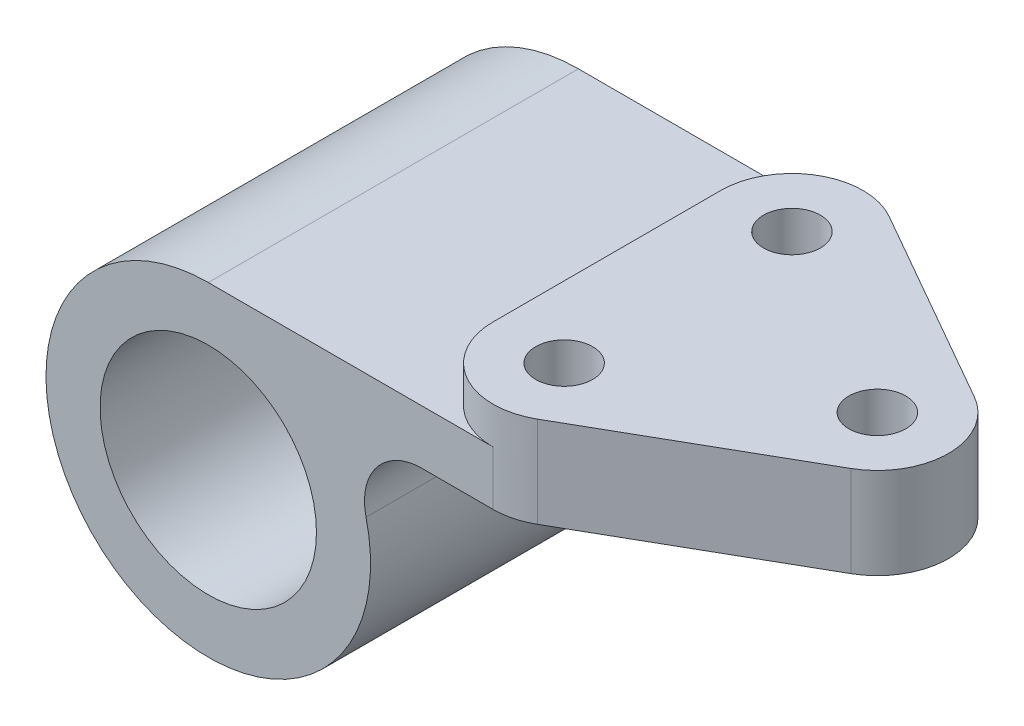
ISO-10303-21;
HEADER;
FILE_DESCRIPTION(('STEP AP214'),'2;1');
FILE_NAME('part.step','',(''),(''),'','','');
FILE_SCHEMA(('AUTOMOTIVE_DESIGN { 1 0 10303 214 1 1 1 1 }'));
ENDSEC;
DATA;
#1=APPLICATION_CONTEXT('core data for automotive mechanical design processes');
#2=APPLICATION_PROTOCOL_DEFINITION('international standard','automotive_design',2000,#1);
#3=PRODUCT_CONTEXT('',#1,'mechanical');
#4=PRODUCT('Part','Part','',(#3));
#5=PRODUCT_RELATED_PRODUCT_CATEGORY('part','',(#4));
#6=PRODUCT_DEFINITION_FORMATION('','',#4);
#7=PRODUCT_DEFINITION_CONTEXT('part definition',#1,'design');
#8=PRODUCT_DEFINITION('design','',#6,#7);
#9=PRODUCT_DEFINITION_SHAPE('','',#8);
#10=(LENGTH_UNIT() NAMED_UNIT(*) SI_UNIT(.MILLI.,.METRE.));
#11=(NAMED_UNIT(*) PLANE_ANGLE_UNIT() SI_UNIT($,.RADIAN.));
#12=(NAMED_UNIT(*) SI_UNIT($,.STERADIAN.) SOLID_ANGLE_UNIT());
#13=UNCERTAINTY_MEASURE_WITH_UNIT(LENGTH_MEASURE(1.E-05),#10,'distance_accuracy_value','');
#14=(GEOMETRIC_REPRESENTATION_CONTEXT(3) GLOBAL_UNCERTAINTY_ASSIGNED_CONTEXT((#13)) GLOBAL_UNIT_ASSIGNED_CONTEXT((#10,
#11,#12)) REPRESENTATION_CONTEXT('',''));
#15=CARTESIAN_POINT('',(0.,0.,0.));
#16=DIRECTION('',(0.,0.,1.));
#17=DIRECTION('',(1.,0.,0.));
#18=AXIS2_PLACEMENT_3D('',#15,#16,#17);
#19=CARTESIAN_POINT('',(37.4332739684896,19.,32.5));
#20=DIRECTION('',(0.,1.,0.));
#21=DIRECTION('',(0.,0.,1.));
#22=AXIS2_PLACEMENT_3D('',#19,#20,#21);
#23=PLANE('',#22);
#24=CARTESIAN_POINT('',(50.,19.,-20.));
#25=DIRECTION('',(0.,1.,0.));
#26=DIRECTION('',(0.,0.,1.));
#27=AXIS2_PLACEMENT_3D('',#24,#25,#26);
#28=CIRCLE('',#27,5.);
#29=CARTESIAN_POINT('',(50.,19.,-15.));
#30=VERTEX_POINT('',#29);
#31=EDGE_CURVE('E250',#30,#30,#28,.T.);
#32=ORIENTED_EDGE('',*,*,#31,.T.);
#33=EDGE_LOOP('',(#32));
#34=FACE_BOUND('',#33,.T.);
#35=DIRECTION('',(1.,0.,0.));
#36=VECTOR('',#35,1.);
#37=CARTESIAN_POINT('',(37.4332739684896,19.,-32.5));
#38=LINE('',#37,#36);
#39=CARTESIAN_POINT('',(37.4332739684896,19.,-32.5));
#40=VERTEX_POINT('',#39);
#41=CARTESIAN_POINT('',(50.,19.,-32.5));
#42=VERTEX_POINT('',#41);
#43=EDGE_CURVE('E178',#40,#42,#38,.T.);
#44=ORIENTED_EDGE('',*,*,#43,.T.);
#45=CARTESIAN_POINT('',(50.,19.,-20.));
#46=DIRECTION('',(0.,1.,0.));
#47=DIRECTION('',(0.,0.,1.));
#48=AXIS2_PLACEMENT_3D('',#45,#46,#47);
#49=CIRCLE('',#48,12.5);
#50=CARTESIAN_POINT('',(56.2017367294604,19.,-30.8530392765557));
#51=VERTEX_POINT('',#50);
#52=EDGE_CURVE('E211',#51,#42,#49,.T.);
#53=ORIENTED_EDGE('',*,*,#52,.F.);
#54=DIRECTION('',(-0.86824314212446,0.,-0.496138938356834));
#55=VECTOR('',#54,1.);
#56=CARTESIAN_POINT('',(69.3437432595526,19.,-23.3433212593602));
#57=LINE('',#56,#55);
#58=CARTESIAN_POINT('',(91.2017367294604,19.,-10.8530392765557));
#59=VERTEX_POINT('',#58);
#60=EDGE_CURVE('E213',#59,#51,#57,.T.);
#61=ORIENTED_EDGE('',*,*,#60,.F.);
#62=CARTESIAN_POINT('',(85.,19.,0.));
#63=DIRECTION('',(0.,1.,0.));
#64=DIRECTION('',(0.,0.,1.));
#65=AXIS2_PLACEMENT_3D('',#62,#63,#64);
#66=CIRCLE('',#65,12.5);
#67=CARTESIAN_POINT('',(91.2017367294604,19.,10.8530392765557));
#68=VERTEX_POINT('',#67);
#69=EDGE_CURVE('E240',#68,#59,#66,.T.);
#70=ORIENTED_EDGE('',*,*,#69,.F.);
#71=DIRECTION('',(0.86824314212446,0.,-0.496138938356834));
#72=VECTOR('',#71,1.);
#73=CARTESIAN_POINT('',(41.3437432595526,19.,39.3433212593602));
#74=LINE('',#73,#72);
#75=CARTESIAN_POINT('',(56.2017367294604,19.,30.8530392765557));
#76=VERTEX_POINT('',#75);
#77=EDGE_CURVE('E153',#76,#68,#74,.T.);
#78=ORIENTED_EDGE('',*,*,#77,.F.);
#79=CARTESIAN_POINT('',(50.,19.,20.));
#80=DIRECTION('',(0.,1.,0.));
#81=DIRECTION('',(0.,0.,1.));
#82=AXIS2_PLACEMENT_3D('',#79,#80,#81);
#83=CIRCLE('',#82,12.5);
#84=CARTESIAN_POINT('',(50.,19.,32.5));
#85=VERTEX_POINT('',#84);
#86=EDGE_CURVE('E149',#85,#76,#83,.T.);
#87=ORIENTED_EDGE('',*,*,#86,.F.);
#88=DIRECTION('',(1.,0.,0.));
#89=VECTOR('',#88,1.);
#90=CARTESIAN_POINT('',(37.4332739684896,19.,32.5));
#91=LINE('',#90,#89);
#92=CARTESIAN_POINT('',(37.4332739684896,19.,32.5));
#93=VERTEX_POINT('',#92);
#94=EDGE_CURVE('E78',#93,#85,#91,.T.);
#95=ORIENTED_EDGE('',*,*,#94,.F.);
#96=DIRECTION('',(0.,0.,-1.));
#97=VECTOR('',#96,1.);
#98=CARTESIAN_POINT('',(37.4332739684896,19.,32.5));
#99=LINE('',#98,#97);
#100=EDGE_CURVE('E188',#93,#40,#99,.T.);
#101=ORIENTED_EDGE('',*,*,#100,.T.);
#102=EDGE_LOOP('',(#44,#53,#61,#70,#78,#87,#95,#101));
#103=FACE_BOUND('',#102,.T.);
#104=CARTESIAN_POINT('',(85.,19.,0.));
#105=DIRECTION('',(0.,1.,0.));
#106=DIRECTION('',(0.,0.,1.));
#107=AXIS2_PLACEMENT_3D('',#104,#105,#106);
#108=CIRCLE('',#107,5.);
#109=CARTESIAN_POINT('',(85.,19.,5.));
#110=VERTEX_POINT('',#109);
#111=EDGE_CURVE('E256',#110,#110,#108,.T.);
#112=ORIENTED_EDGE('',*,*,#111,.T.);
#113=EDGE_LOOP('',(#112));
#114=FACE_BOUND('',#113,.T.);
#115=CARTESIAN_POINT('',(50.,19.,20.));
#116=DIRECTION('',(0.,1.,0.));
#117=DIRECTION('',(0.,0.,1.));
#118=AXIS2_PLACEMENT_3D('',#115,#116,#117);
#119=CIRCLE('',#118,5.);
#120=CARTESIAN_POINT('',(50.,19.,25.));
#121=VERTEX_POINT('',#120);
#122=EDGE_CURVE('E244',#121,#121,#119,.T.);
#123=ORIENTED_EDGE('',*,*,#122,.T.);
#124=EDGE_LOOP('',(#123));
#125=FACE_BOUND('',#124,.T.);
#126=ADVANCED_FACE('F34',(#34,#103,#114,#125),#23,.F.);
#127=CARTESIAN_POINT('',(37.4332739684896,9.,32.5));
#128=DIRECTION('',(0.,0.,1.));
#129=DIRECTION('',(1.,0.,0.));
#130=AXIS2_PLACEMENT_3D('',#127,#128,#129);
#131=PLANE('',#130);
#132=CARTESIAN_POINT('',(37.4332739684896,9.,32.5));
#133=DIRECTION('',(0.,0.,-1.));
#134=DIRECTION('',(1.,0.,0.));
#135=AXIS2_PLACEMENT_3D('',#132,#133,#134);
#136=CIRCLE('',#135,10.);
#137=CARTESIAN_POINT('',(27.7103456649858,6.66233766233765,32.5));
#138=VERTEX_POINT('',#137);
#139=EDGE_CURVE('E166',#138,#93,#136,.T.);
#140=ORIENTED_EDGE('',*,*,#139,.T.);
#141=ORIENTED_EDGE('',*,*,#94,.T.);
#142=DIRECTION('',(0.,1.,0.));
#143=VECTOR('',#142,1.);
#144=CARTESIAN_POINT('',(50.,19.,32.5));
#145=LINE('',#144,#143);
#146=CARTESIAN_POINT('',(50.,28.5,32.5));
#147=VERTEX_POINT('',#146);
#148=EDGE_CURVE('E169',#85,#147,#145,.T.);
#149=ORIENTED_EDGE('',*,*,#148,.T.);
#150=DIRECTION('',(-1.,0.,0.));
#151=VECTOR('',#150,1.);
#152=CARTESIAN_POINT('',(0.,28.5,32.5));
#153=LINE('',#152,#151);
#154=CARTESIAN_POINT('',(0.,28.5,32.5));
#155=VERTEX_POINT('',#154);
#156=EDGE_CURVE('E172',#147,#155,#153,.T.);
#157=ORIENTED_EDGE('',*,*,#156,.T.);
#158=CARTESIAN_POINT('',(0.,0.,32.5));
#159=DIRECTION('',(0.,0.,1.));
#160=DIRECTION('',(1.,0.,0.));
#161=AXIS2_PLACEMENT_3D('',#158,#159,#160);
#162=CIRCLE('',#161,28.5);
#163=EDGE_CURVE('E51',#155,#138,#162,.T.);
#164=ORIENTED_EDGE('',*,*,#163,.T.);
#165=EDGE_LOOP('',(#140,#141,#149,#157,#164));
#166=FACE_BOUND('',#165,.T.);
#167=CARTESIAN_POINT('',(0.,0.,32.5));
#168=DIRECTION('',(0.,0.,1.));
#169=DIRECTION('',(1.,0.,0.));
#170=AXIS2_PLACEMENT_3D('',#167,#168,#169);
#171=CIRCLE('',#170,19.);
#172=CARTESIAN_POINT('',(19.,0.,32.5));
#173=VERTEX_POINT('',#172);
#174=EDGE_CURVE('E157',#173,#173,#171,.T.);
#175=ORIENTED_EDGE('',*,*,#174,.F.);
#176=EDGE_LOOP('',(#175));
#177=FACE_BOUND('',#176,.T.);
#178=ADVANCED_FACE('F208',(#166,#177),#131,.T.);
#179=CARTESIAN_POINT('',(37.4332739684896,9.,-32.5));
#180=DIRECTION('',(0.,0.,1.));
#181=DIRECTION('',(1.,0.,0.));
#182=AXIS2_PLACEMENT_3D('',#179,#180,#181);
#183=PLANE('',#182);
#184=CARTESIAN_POINT('',(37.4332739684896,9.,-32.5));
#185=DIRECTION('',(0.,0.,-1.));
#186=DIRECTION('',(1.,0.,0.));
#187=AXIS2_PLACEMENT_3D('',#184,#185,#186);
#188=CIRCLE('',#187,10.);
#189=CARTESIAN_POINT('',(27.7103456649858,6.66233766233765,-32.5));
#190=VERTEX_POINT('',#189);
#191=EDGE_CURVE('E164',#190,#40,#188,.T.);
#192=ORIENTED_EDGE('',*,*,#191,.F.);
#193=CARTESIAN_POINT('',(0.,0.,-32.5));
#194=DIRECTION('',(0.,0.,1.));
#195=DIRECTION('',(1.,0.,0.));
#196=AXIS2_PLACEMENT_3D('',#193,#194,#195);
#197=CIRCLE('',#196,28.5);
#198=CARTESIAN_POINT('',(0.,28.5,-32.5));
#199=VERTEX_POINT('',#198);
#200=EDGE_CURVE('E71',#199,#190,#197,.T.);
#201=ORIENTED_EDGE('',*,*,#200,.F.);
#202=DIRECTION('',(-1.,0.,0.));
#203=VECTOR('',#202,1.);
#204=CARTESIAN_POINT('',(0.,28.5,-32.5));
#205=LINE('',#204,#203);
#206=CARTESIAN_POINT('',(50.,28.5,-32.5));
#207=VERTEX_POINT('',#206);
#208=EDGE_CURVE('E66',#207,#199,#205,.T.);
#209=ORIENTED_EDGE('',*,*,#208,.F.);
#210=DIRECTION('',(0.,1.,0.));
#211=VECTOR('',#210,1.);
#212=CARTESIAN_POINT('',(50.,19.,-32.5));
#213=LINE('',#212,#211);
#214=EDGE_CURVE('E181',#42,#207,#213,.T.);
#215=ORIENTED_EDGE('',*,*,#214,.F.);
#216=ORIENTED_EDGE('',*,*,#43,.F.);
#217=EDGE_LOOP('',(#192,#201,#209,#215,#216));
#218=FACE_BOUND('',#217,.T.);
#219=CARTESIAN_POINT('',(0.,0.,-32.5));
#220=DIRECTION('',(0.,0.,1.));
#221=DIRECTION('',(1.,0.,0.));
#222=AXIS2_PLACEMENT_3D('',#219,#220,#221);
#223=CIRCLE('',#222,19.);
#224=CARTESIAN_POINT('',(19.,0.,-32.5));
#225=VERTEX_POINT('',#224);
#226=EDGE_CURVE('E154',#225,#225,#223,.T.);
#227=ORIENTED_EDGE('',*,*,#226,.T.);
#228=EDGE_LOOP('',(#227));
#229=FACE_BOUND('',#228,.T.);
#230=ADVANCED_FACE('F231',(#218,#229),#183,.F.);
#231=CARTESIAN_POINT('',(37.4332739684896,9.,32.5));
#232=DIRECTION('',(0.,0.,-1.));
#233=DIRECTION('',(-1.,0.,0.));
#234=AXIS2_PLACEMENT_3D('',#231,#232,#233);
#235=CYLINDRICAL_SURFACE('',#234,10.);
#236=ORIENTED_EDGE('',*,*,#191,.T.);
#237=ORIENTED_EDGE('',*,*,#100,.F.);
#238=ORIENTED_EDGE('',*,*,#139,.F.);
#239=DIRECTION('',(0.,0.,-1.));
#240=VECTOR('',#239,1.);
#241=CARTESIAN_POINT('',(27.7103456649858,6.66233766233765,32.5));
#242=LINE('',#241,#240);
#243=EDGE_CURVE('E175',#138,#190,#242,.T.);
#244=ORIENTED_EDGE('',*,*,#243,.T.);
#245=EDGE_LOOP('',(#236,#237,#238,#244));
#246=FACE_BOUND('',#245,.T.);
#247=ADVANCED_FACE('F36',(#246),#235,.F.);
#248=CARTESIAN_POINT('',(0.,28.5,32.5));
#249=DIRECTION('',(0.,-1.,0.));
#250=DIRECTION('',(0.,0.,-1.));
#251=AXIS2_PLACEMENT_3D('',#248,#249,#250);
#252=PLANE('',#251);
#253=CARTESIAN_POINT('',(50.,28.5,-20.));
#254=DIRECTION('',(0.,-1.,0.));
#255=DIRECTION('',(0.,0.,-1.));
#256=AXIS2_PLACEMENT_3D('',#253,#254,#255);
#257=CIRCLE('',#256,12.5);
#258=CARTESIAN_POINT('',(37.5,28.5,-20.));
#259=VERTEX_POINT('',#258);
#260=EDGE_CURVE('E11',#207,#259,#257,.F.);
#261=ORIENTED_EDGE('',*,*,#260,.F.);
#262=ORIENTED_EDGE('',*,*,#208,.T.);
#263=DIRECTION('',(0.,0.,-1.));
#264=VECTOR('',#263,1.);
#265=CARTESIAN_POINT('',(0.,28.5,32.5));
#266=LINE('',#265,#264);
#267=EDGE_CURVE('E186',#155,#199,#266,.T.);
#268=ORIENTED_EDGE('',*,*,#267,.F.);
#269=ORIENTED_EDGE('',*,*,#156,.F.);
#270=CARTESIAN_POINT('',(50.,28.5,20.));
#271=DIRECTION('',(0.,-1.,0.));
#272=DIRECTION('',(0.,0.,-1.));
#273=AXIS2_PLACEMENT_3D('',#270,#271,#272);
#274=CIRCLE('',#273,12.5);
#275=CARTESIAN_POINT('',(37.5,28.5,20.));
#276=VERTEX_POINT('',#275);
#277=EDGE_CURVE('E190',#276,#147,#274,.F.);
#278=ORIENTED_EDGE('',*,*,#277,.F.);
#279=DIRECTION('',(0.,0.,1.));
#280=VECTOR('',#279,1.);
#281=CARTESIAN_POINT('',(37.5,28.5,32.5));
#282=LINE('',#281,#280);
#283=EDGE_CURVE('E43',#259,#276,#282,.T.);
#284=ORIENTED_EDGE('',*,*,#283,.F.);
#285=EDGE_LOOP('',(#261,#262,#268,#269,#278,#284));
#286=FACE_BOUND('',#285,.T.);
#287=ADVANCED_FACE('F207',(#286),#252,.F.);
#288=CARTESIAN_POINT('',(0.,0.,32.5));
#289=DIRECTION('',(0.,0.,-1.));
#290=DIRECTION('',(-1.,0.,0.));
#291=AXIS2_PLACEMENT_3D('',#288,#289,#290);
#292=CYLINDRICAL_SURFACE('',#291,28.5);
#293=ORIENTED_EDGE('',*,*,#200,.T.);
#294=ORIENTED_EDGE('',*,*,#243,.F.);
#295=ORIENTED_EDGE('',*,*,#163,.F.);
#296=ORIENTED_EDGE('',*,*,#267,.T.);
#297=EDGE_LOOP('',(#293,#294,#295,#296));
#298=FACE_BOUND('',#297,.T.);
#299=ADVANCED_FACE('F289',(#298),#292,.T.);
#300=CARTESIAN_POINT('',(0.,0.,32.5));
#301=DIRECTION('',(0.,0.,-1.));
#302=DIRECTION('',(-1.,0.,0.));
#303=AXIS2_PLACEMENT_3D('',#300,#301,#302);
#304=CYLINDRICAL_SURFACE('',#303,19.);
#305=ORIENTED_EDGE('',*,*,#174,.T.);
#306=EDGE_LOOP('',(#305));
#307=FACE_BOUND('',#306,.T.);
#308=ORIENTED_EDGE('',*,*,#226,.F.);
#309=EDGE_LOOP('',(#308));
#310=FACE_BOUND('',#309,.T.);
#311=ADVANCED_FACE('F292',(#307,#310),#304,.F.);
#312=CARTESIAN_POINT('',(50.,35.,-20.));
#313=DIRECTION('',(0.,-1.,0.));
#314=DIRECTION('',(0.,0.,-1.));
#315=AXIS2_PLACEMENT_3D('',#312,#313,#314);
#316=CYLINDRICAL_SURFACE('',#315,12.5);
#317=ORIENTED_EDGE('',*,*,#52,.T.);
#318=ORIENTED_EDGE('',*,*,#214,.T.);
#319=ORIENTED_EDGE('',*,*,#260,.T.);
#320=DIRECTION('',(0.,-1.,0.));
#321=VECTOR('',#320,1.);
#322=CARTESIAN_POINT('',(37.5,35.,-20.));
#323=LINE('',#322,#321);
#324=CARTESIAN_POINT('',(37.5,35.,-20.));
#325=VERTEX_POINT('',#324);
#326=EDGE_CURVE('E200',#325,#259,#323,.T.);
#327=ORIENTED_EDGE('',*,*,#326,.F.);
#328=CARTESIAN_POINT('',(50.,35.,-20.));
#329=DIRECTION('',(0.,1.,0.));
#330=DIRECTION('',(0.,0.,1.));
#331=AXIS2_PLACEMENT_3D('',#328,#329,#330);
#332=CIRCLE('',#331,12.5);
#333=CARTESIAN_POINT('',(56.2017367294604,35.,-30.8530392765557));
#334=VERTEX_POINT('',#333);
#335=EDGE_CURVE('E224',#334,#325,#332,.T.);
#336=ORIENTED_EDGE('',*,*,#335,.F.);
#337=DIRECTION('',(0.,-1.,0.));
#338=VECTOR('',#337,1.);
#339=CARTESIAN_POINT('',(56.2017367294604,35.,-30.8530392765557));
#340=LINE('',#339,#338);
#341=EDGE_CURVE('E159',#334,#51,#340,.T.);
#342=ORIENTED_EDGE('',*,*,#341,.T.);
#343=EDGE_LOOP('',(#317,#318,#319,#327,#336,#342));
#344=FACE_BOUND('',#343,.T.);
#345=ADVANCED_FACE('F223',(#344),#316,.T.);
#346=CARTESIAN_POINT('',(37.5,35.,32.5));
#347=DIRECTION('',(1.,0.,0.));
#348=DIRECTION('',(0.,0.,-1.));
#349=AXIS2_PLACEMENT_3D('',#346,#347,#348);
#350=PLANE('',#349);
#351=ORIENTED_EDGE('',*,*,#326,.T.);
#352=ORIENTED_EDGE('',*,*,#283,.T.);
#353=DIRECTION('',(0.,-1.,0.));
#354=VECTOR('',#353,1.);
#355=CARTESIAN_POINT('',(37.5,35.,20.));
#356=LINE('',#355,#354);
#357=CARTESIAN_POINT('',(37.5,35.,20.));
#358=VERTEX_POINT('',#357);
#359=EDGE_CURVE('E198',#358,#276,#356,.T.);
#360=ORIENTED_EDGE('',*,*,#359,.F.);
#361=DIRECTION('',(0.,0.,1.));
#362=VECTOR('',#361,1.);
#363=CARTESIAN_POINT('',(37.5,35.,32.5));
#364=LINE('',#363,#362);
#365=EDGE_CURVE('E233',#325,#358,#364,.T.);
#366=ORIENTED_EDGE('',*,*,#365,.F.);
#367=EDGE_LOOP('',(#351,#352,#360,#366));
#368=FACE_BOUND('',#367,.T.);
#369=ADVANCED_FACE('F196',(#368),#350,.F.);
#370=CARTESIAN_POINT('',(50.,35.,20.));
#371=DIRECTION('',(0.,-1.,0.));
#372=DIRECTION('',(0.,0.,-1.));
#373=AXIS2_PLACEMENT_3D('',#370,#371,#372);
#374=CYLINDRICAL_SURFACE('',#373,12.5);
#375=ORIENTED_EDGE('',*,*,#277,.T.);
#376=ORIENTED_EDGE('',*,*,#148,.F.);
#377=ORIENTED_EDGE('',*,*,#86,.T.);
#378=DIRECTION('',(0.,-1.,0.));
#379=VECTOR('',#378,1.);
#380=CARTESIAN_POINT('',(56.2017367294604,35.,30.8530392765557));
#381=LINE('',#380,#379);
#382=CARTESIAN_POINT('',(56.2017367294604,35.,30.8530392765557));
#383=VERTEX_POINT('',#382);
#384=EDGE_CURVE('E204',#383,#76,#381,.T.);
#385=ORIENTED_EDGE('',*,*,#384,.F.);
#386=CARTESIAN_POINT('',(50.,35.,20.));
#387=DIRECTION('',(0.,1.,0.));
#388=DIRECTION('',(0.,0.,1.));
#389=AXIS2_PLACEMENT_3D('',#386,#387,#388);
#390=CIRCLE('',#389,12.5);
#391=EDGE_CURVE('E145',#358,#383,#390,.T.);
#392=ORIENTED_EDGE('',*,*,#391,.F.);
#393=ORIENTED_EDGE('',*,*,#359,.T.);
#394=EDGE_LOOP('',(#375,#376,#377,#385,#392,#393));
#395=FACE_BOUND('',#394,.T.);
#396=ADVANCED_FACE('F203',(#395),#374,.T.);
#397=CARTESIAN_POINT('',(50.,35.,20.));
#398=DIRECTION('',(0.,-1.,0.));
#399=DIRECTION('',(0.,0.,-1.));
#400=AXIS2_PLACEMENT_3D('',#397,#398,#399);
#401=CYLINDRICAL_SURFACE('',#400,5.);
#402=ORIENTED_EDGE('',*,*,#122,.F.);
#403=EDGE_LOOP('',(#402));
#404=FACE_BOUND('',#403,.T.);
#405=CARTESIAN_POINT('',(50.,35.,20.));
#406=DIRECTION('',(0.,1.,0.));
#407=DIRECTION('',(0.,0.,1.));
#408=AXIS2_PLACEMENT_3D('',#405,#406,#407);
#409=CIRCLE('',#408,5.);
#410=CARTESIAN_POINT('',(50.,35.,25.));
#411=VERTEX_POINT('',#410);
#412=EDGE_CURVE('E241',#411,#411,#409,.T.);
#413=ORIENTED_EDGE('',*,*,#412,.T.);
#414=EDGE_LOOP('',(#413));
#415=FACE_BOUND('',#414,.T.);
#416=ADVANCED_FACE('F274',(#404,#415),#401,.F.);
#417=CARTESIAN_POINT('',(50.,35.,-20.));
#418=DIRECTION('',(0.,-1.,0.));
#419=DIRECTION('',(0.,0.,-1.));
#420=AXIS2_PLACEMENT_3D('',#417,#418,#419);
#421=CYLINDRICAL_SURFACE('',#420,5.);
#422=ORIENTED_EDGE('',*,*,#31,.F.);
#423=EDGE_LOOP('',(#422));
#424=FACE_BOUND('',#423,.T.);
#425=CARTESIAN_POINT('',(50.,35.,-20.));
#426=DIRECTION('',(0.,1.,0.));
#427=DIRECTION('',(0.,0.,1.));
#428=AXIS2_PLACEMENT_3D('',#425,#426,#427);
#429=CIRCLE('',#428,5.);
#430=CARTESIAN_POINT('',(50.,35.,-15.));
#431=VERTEX_POINT('',#430);
#432=EDGE_CURVE('E247',#431,#431,#429,.T.);
#433=ORIENTED_EDGE('',*,*,#432,.T.);
#434=EDGE_LOOP('',(#433));
#435=FACE_BOUND('',#434,.T.);
#436=ADVANCED_FACE('F266',(#424,#435),#421,.F.);
#437=CARTESIAN_POINT('',(85.,35.,0.));
#438=DIRECTION('',(0.,1.,0.));
#439=DIRECTION('',(0.,0.,1.));
#440=AXIS2_PLACEMENT_3D('',#437,#438,#439);
#441=PLANE('',#440);
#442=ORIENTED_EDGE('',*,*,#432,.F.);
#443=EDGE_LOOP('',(#442));
#444=FACE_BOUND('',#443,.T.);
#445=DIRECTION('',(0.86824314212446,0.,-0.496138938356834));
#446=VECTOR('',#445,1.);
#447=CARTESIAN_POINT('',(41.3437432595526,35.,39.3433212593602));
#448=LINE('',#447,#446);
#449=CARTESIAN_POINT('',(91.2017367294604,35.,10.8530392765557));
#450=VERTEX_POINT('',#449);
#451=EDGE_CURVE('E139',#383,#450,#448,.T.);
#452=ORIENTED_EDGE('',*,*,#451,.T.);
#453=CARTESIAN_POINT('',(85.,35.,0.));
#454=DIRECTION('',(0.,1.,0.));
#455=DIRECTION('',(0.,0.,1.));
#456=AXIS2_PLACEMENT_3D('',#453,#454,#455);
#457=CIRCLE('',#456,12.5);
#458=CARTESIAN_POINT('',(91.2017367294604,35.,-10.8530392765557));
#459=VERTEX_POINT('',#458);
#460=EDGE_CURVE('E128',#450,#459,#457,.T.);
#461=ORIENTED_EDGE('',*,*,#460,.T.);
#462=DIRECTION('',(-0.86824314212446,0.,-0.496138938356834));
#463=VECTOR('',#462,1.);
#464=CARTESIAN_POINT('',(69.3437432595526,35.,-23.3433212593602));
#465=LINE('',#464,#463);
#466=EDGE_CURVE('E138',#459,#334,#465,.T.);
#467=ORIENTED_EDGE('',*,*,#466,.T.);
#468=ORIENTED_EDGE('',*,*,#335,.T.);
#469=ORIENTED_EDGE('',*,*,#365,.T.);
#470=ORIENTED_EDGE('',*,*,#391,.T.);
#471=EDGE_LOOP('',(#452,#461,#467,#468,#469,#470));
#472=FACE_BOUND('',#471,.T.);
#473=ORIENTED_EDGE('',*,*,#412,.F.);
#474=EDGE_LOOP('',(#473));
#475=FACE_BOUND('',#474,.T.);
#476=CARTESIAN_POINT('',(85.,35.,0.));
#477=DIRECTION('',(0.,1.,0.));
#478=DIRECTION('',(0.,0.,1.));
#479=AXIS2_PLACEMENT_3D('',#476,#477,#478);
#480=CIRCLE('',#479,5.);
#481=CARTESIAN_POINT('',(85.,35.,5.));
#482=VERTEX_POINT('',#481);
#483=EDGE_CURVE('E253',#482,#482,#480,.T.);
#484=ORIENTED_EDGE('',*,*,#483,.F.);
#485=EDGE_LOOP('',(#484));
#486=FACE_BOUND('',#485,.T.);
#487=ADVANCED_FACE('F142',(#444,#472,#475,#486),#441,.T.);
#488=CARTESIAN_POINT('',(41.3437432595526,35.,39.3433212593602));
#489=DIRECTION('',(-0.496138938356834,0.,-0.868243142124459));
#490=DIRECTION('',(-0.86824314212446,0.,0.496138938356834));
#491=AXIS2_PLACEMENT_3D('',#488,#489,#490);
#492=PLANE('',#491);
#493=ORIENTED_EDGE('',*,*,#77,.T.);
#494=DIRECTION('',(0.,-1.,0.));
#495=VECTOR('',#494,1.);
#496=CARTESIAN_POINT('',(91.2017367294604,35.,10.8530392765557));
#497=LINE('',#496,#495);
#498=EDGE_CURVE('E132',#450,#68,#497,.T.);
#499=ORIENTED_EDGE('',*,*,#498,.F.);
#500=ORIENTED_EDGE('',*,*,#451,.F.);
#501=ORIENTED_EDGE('',*,*,#384,.T.);
#502=EDGE_LOOP('',(#493,#499,#500,#501));
#503=FACE_BOUND('',#502,.T.);
#504=ADVANCED_FACE('F151',(#503),#492,.F.);
#505=CARTESIAN_POINT('',(85.,35.,0.));
#506=DIRECTION('',(0.,-1.,0.));
#507=DIRECTION('',(0.,0.,-1.));
#508=AXIS2_PLACEMENT_3D('',#505,#506,#507);
#509=CYLINDRICAL_SURFACE('',#508,12.5);
#510=ORIENTED_EDGE('',*,*,#69,.T.);
#511=DIRECTION('',(0.,-1.,0.));
#512=VECTOR('',#511,1.);
#513=CARTESIAN_POINT('',(91.2017367294604,35.,-10.8530392765557));
#514=LINE('',#513,#512);
#515=EDGE_CURVE('E135',#459,#59,#514,.T.);
#516=ORIENTED_EDGE('',*,*,#515,.F.);
#517=ORIENTED_EDGE('',*,*,#460,.F.);
#518=ORIENTED_EDGE('',*,*,#498,.T.);
#519=EDGE_LOOP('',(#510,#516,#517,#518));
#520=FACE_BOUND('',#519,.T.);
#521=ADVANCED_FACE('F130',(#520),#509,.T.);
#522=CARTESIAN_POINT('',(69.3437432595526,35.,-23.3433212593602));
#523=DIRECTION('',(-0.496138938356834,0.,0.868243142124459));
#524=DIRECTION('',(0.86824314212446,0.,0.496138938356834));
#525=AXIS2_PLACEMENT_3D('',#522,#523,#524);
#526=PLANE('',#525);
#527=ORIENTED_EDGE('',*,*,#60,.T.);
#528=ORIENTED_EDGE('',*,*,#341,.F.);
#529=ORIENTED_EDGE('',*,*,#466,.F.);
#530=ORIENTED_EDGE('',*,*,#515,.T.);
#531=EDGE_LOOP('',(#527,#528,#529,#530));
#532=FACE_BOUND('',#531,.T.);
#533=ADVANCED_FACE('F242',(#532),#526,.F.);
#534=CARTESIAN_POINT('',(85.,35.,0.));
#535=DIRECTION('',(0.,-1.,0.));
#536=DIRECTION('',(0.,0.,-1.));
#537=AXIS2_PLACEMENT_3D('',#534,#535,#536);
#538=CYLINDRICAL_SURFACE('',#537,5.);
#539=ORIENTED_EDGE('',*,*,#483,.T.);
#540=EDGE_LOOP('',(#539));
#541=FACE_BOUND('',#540,.T.);
#542=ORIENTED_EDGE('',*,*,#111,.F.);
#543=EDGE_LOOP('',(#542));
#544=FACE_BOUND('',#543,.T.);
#545=ADVANCED_FACE('F262',(#541,#544),#538,.F.);
#546=CLOSED_SHELL('',(#126,#178,#230,#247,#287,#299,#311,#345,#369,#396,#416,#436,#487,#504,
#521,#533,#545));
#547=MANIFOLD_SOLID_BREP('B2',#546);
#548=ADVANCED_BREP_SHAPE_REPRESENTATION('',(#18,#547),#14);
#549=SHAPE_DEFINITION_REPRESENTATION(#9,#548);
ENDSEC;
END-ISO-10303-21;
